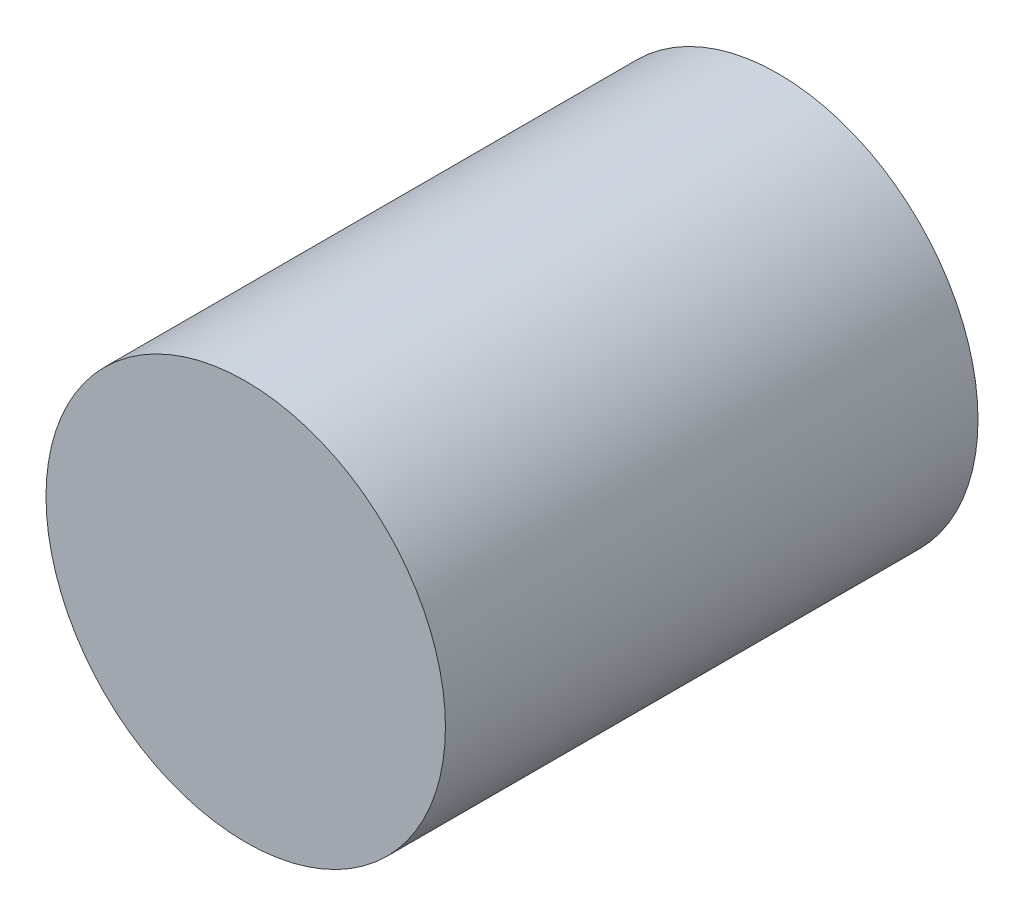
ISO-10303-21;
HEADER;
FILE_DESCRIPTION(('STEP AP214'),'2;1');
FILE_NAME('part.step','',(''),(''),'','','');
FILE_SCHEMA(('AUTOMOTIVE_DESIGN { 1 0 10303 214 1 1 1 1 }'));
ENDSEC;
DATA;
#1=APPLICATION_CONTEXT('core data for automotive mechanical design processes');
#2=APPLICATION_PROTOCOL_DEFINITION('international standard','automotive_design',2000,#1);
#3=PRODUCT_CONTEXT('',#1,'mechanical');
#4=PRODUCT('Part','Part','',(#3));
#5=PRODUCT_RELATED_PRODUCT_CATEGORY('part','',(#4));
#6=PRODUCT_DEFINITION_FORMATION('','',#4);
#7=PRODUCT_DEFINITION_CONTEXT('part definition',#1,'design');
#8=PRODUCT_DEFINITION('design','',#6,#7);
#9=PRODUCT_DEFINITION_SHAPE('','',#8);
#10=(LENGTH_UNIT() NAMED_UNIT(*) SI_UNIT(.MILLI.,.METRE.));
#11=(NAMED_UNIT(*) PLANE_ANGLE_UNIT() SI_UNIT($,.RADIAN.));
#12=(NAMED_UNIT(*) SI_UNIT($,.STERADIAN.) SOLID_ANGLE_UNIT());
#13=UNCERTAINTY_MEASURE_WITH_UNIT(LENGTH_MEASURE(1.E-05),#10,'distance_accuracy_value','');
#14=(GEOMETRIC_REPRESENTATION_CONTEXT(3) GLOBAL_UNCERTAINTY_ASSIGNED_CONTEXT((#13)) GLOBAL_UNIT_ASSIGNED_CONTEXT((#10,
#11,#12)) REPRESENTATION_CONTEXT('',''));
#15=CARTESIAN_POINT('',(0.,0.,0.));
#16=DIRECTION('',(0.,0.,1.));
#17=DIRECTION('',(1.,0.,0.));
#18=AXIS2_PLACEMENT_3D('',#15,#16,#17);
#19=CARTESIAN_POINT('',(-25.,-30.,20.));
#20=DIRECTION('',(0.,0.,-1.));
#21=DIRECTION('',(-1.,0.,0.));
#22=AXIS2_PLACEMENT_3D('',#19,#20,#21);
#23=CYLINDRICAL_SURFACE('',#22,7.5);
#24=CARTESIAN_POINT('',(-25.,-30.,20.));
#25=DIRECTION('',(0.,0.,1.));
#26=DIRECTION('',(1.,0.,0.));
#27=AXIS2_PLACEMENT_3D('',#24,#25,#26);
#28=CIRCLE('',#27,7.5);
#29=CARTESIAN_POINT('',(-17.5,-30.,20.));
#30=VERTEX_POINT('',#29);
#31=EDGE_CURVE('E10',#30,#30,#28,.T.);
#32=ORIENTED_EDGE('',*,*,#31,.F.);
#33=EDGE_LOOP('',(#32));
#34=FACE_BOUND('',#33,.T.);
#35=CARTESIAN_POINT('',(-25.,-30.,0.));
#36=DIRECTION('',(0.,0.,1.));
#37=DIRECTION('',(1.,0.,0.));
#38=AXIS2_PLACEMENT_3D('',#35,#36,#37);
#39=CIRCLE('',#38,7.5);
#40=CARTESIAN_POINT('',(-17.5,-30.,0.));
#41=VERTEX_POINT('',#40);
#42=EDGE_CURVE('E36',#41,#41,#39,.T.);
#43=ORIENTED_EDGE('',*,*,#42,.T.);
#44=EDGE_LOOP('',(#43));
#45=FACE_BOUND('',#44,.T.);
#46=ADVANCED_FACE('F33',(#34,#45),#23,.T.);
#47=CARTESIAN_POINT('',(-25.,-30.,20.));
#48=DIRECTION('',(0.,0.,1.));
#49=DIRECTION('',(1.,0.,0.));
#50=AXIS2_PLACEMENT_3D('',#47,#48,#49);
#51=PLANE('',#50);
#52=ORIENTED_EDGE('',*,*,#31,.T.);
#53=EDGE_LOOP('',(#52));
#54=FACE_BOUND('',#53,.T.);
#55=ADVANCED_FACE('F48',(#54),#51,.T.);
#56=CARTESIAN_POINT('',(-25.,-30.,0.));
#57=DIRECTION('',(0.,0.,1.));
#58=DIRECTION('',(1.,0.,0.));
#59=AXIS2_PLACEMENT_3D('',#56,#57,#58);
#60=PLANE('',#59);
#61=ORIENTED_EDGE('',*,*,#42,.F.);
#62=EDGE_LOOP('',(#61));
#63=FACE_BOUND('',#62,.T.);
#64=ADVANCED_FACE('F46',(#63),#60,.F.);
#65=CLOSED_SHELL('',(#46,#55,#64));
#66=MANIFOLD_SOLID_BREP('B2',#65);
#67=ADVANCED_BREP_SHAPE_REPRESENTATION('',(#18,#66),#14);
#68=SHAPE_DEFINITION_REPRESENTATION(#9,#67);
ENDSEC;
END-ISO-10303-21;
